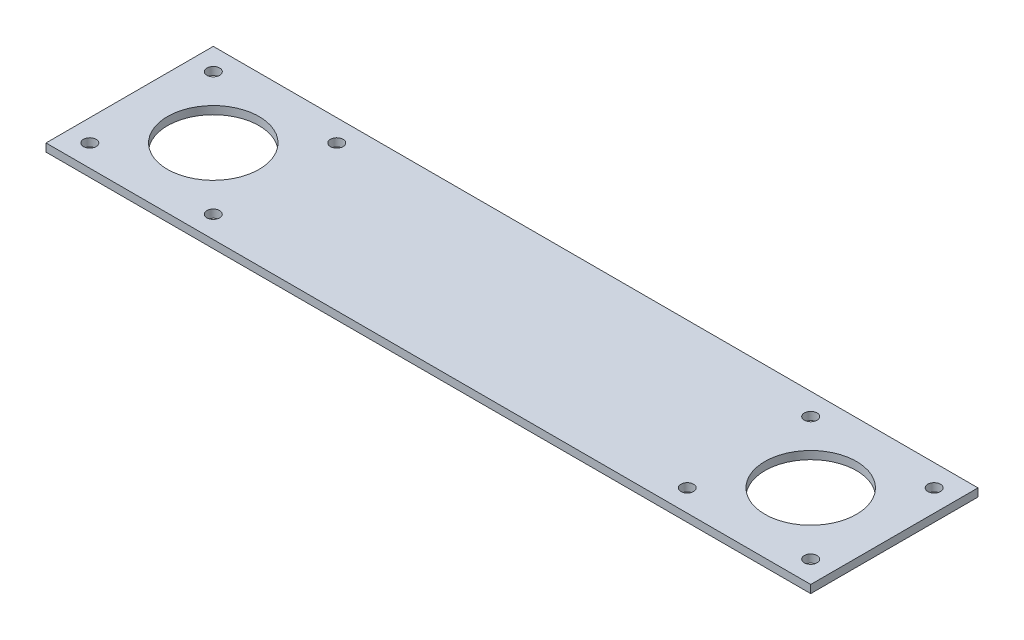
ISO-10303-21;
HEADER;
FILE_DESCRIPTION(('STEP AP214'),'2;1');
FILE_NAME('part.step','',(''),(''),'','','');
FILE_SCHEMA(('AUTOMOTIVE_DESIGN { 1 0 10303 214 1 1 1 1 }'));
ENDSEC;
DATA;
#1=APPLICATION_CONTEXT('core data for automotive mechanical design processes');
#2=APPLICATION_PROTOCOL_DEFINITION('international standard','automotive_design',2000,#1);
#3=PRODUCT_CONTEXT('',#1,'mechanical');
#4=PRODUCT('Part','Part','',(#3));
#5=PRODUCT_RELATED_PRODUCT_CATEGORY('part','',(#4));
#6=PRODUCT_DEFINITION_FORMATION('','',#4);
#7=PRODUCT_DEFINITION_CONTEXT('part definition',#1,'design');
#8=PRODUCT_DEFINITION('design','',#6,#7);
#9=PRODUCT_DEFINITION_SHAPE('','',#8);
#10=(LENGTH_UNIT() NAMED_UNIT(*) SI_UNIT(.MILLI.,.METRE.));
#11=(NAMED_UNIT(*) PLANE_ANGLE_UNIT() SI_UNIT($,.RADIAN.));
#12=(NAMED_UNIT(*) SI_UNIT($,.STERADIAN.) SOLID_ANGLE_UNIT());
#13=UNCERTAINTY_MEASURE_WITH_UNIT(LENGTH_MEASURE(1.E-05),#10,'distance_accuracy_value','');
#14=(GEOMETRIC_REPRESENTATION_CONTEXT(3) GLOBAL_UNCERTAINTY_ASSIGNED_CONTEXT((#13)) GLOBAL_UNIT_ASSIGNED_CONTEXT((#10,
#11,#12)) REPRESENTATION_CONTEXT('',''));
#15=CARTESIAN_POINT('',(0.,0.,0.));
#16=DIRECTION('',(0.,0.,1.));
#17=DIRECTION('',(1.,0.,0.));
#18=AXIS2_PLACEMENT_3D('',#15,#16,#17);
#19=CARTESIAN_POINT('',(96.,2.,0.));
#20=DIRECTION('',(1.,0.,0.));
#21=DIRECTION('',(0.,0.,-1.));
#22=AXIS2_PLACEMENT_3D('',#19,#20,#21);
#23=PLANE('',#22);
#24=DIRECTION('',(0.,0.,1.));
#25=VECTOR('',#24,1.);
#26=CARTESIAN_POINT('',(96.,0.,0.));
#27=LINE('',#26,#25);
#28=CARTESIAN_POINT('',(96.,0.,-21.));
#29=VERTEX_POINT('',#28);
#30=CARTESIAN_POINT('',(96.,0.,21.));
#31=VERTEX_POINT('',#30);
#32=EDGE_CURVE('E160',#29,#31,#27,.T.);
#33=ORIENTED_EDGE('',*,*,#32,.F.);
#34=DIRECTION('',(0.,-1.,0.));
#35=VECTOR('',#34,1.);
#36=CARTESIAN_POINT('',(96.,2.,-21.));
#37=LINE('',#36,#35);
#38=CARTESIAN_POINT('',(96.,2.,-21.));
#39=VERTEX_POINT('',#38);
#40=EDGE_CURVE('E11',#39,#29,#37,.T.);
#41=ORIENTED_EDGE('',*,*,#40,.F.);
#42=DIRECTION('',(0.,0.,1.));
#43=VECTOR('',#42,1.);
#44=CARTESIAN_POINT('',(96.,2.,0.));
#45=LINE('',#44,#43);
#46=CARTESIAN_POINT('',(96.,2.,21.));
#47=VERTEX_POINT('',#46);
#48=EDGE_CURVE('E110',#39,#47,#45,.T.);
#49=ORIENTED_EDGE('',*,*,#48,.T.);
#50=DIRECTION('',(0.,-1.,0.));
#51=VECTOR('',#50,1.);
#52=CARTESIAN_POINT('',(96.,2.,21.));
#53=LINE('',#52,#51);
#54=EDGE_CURVE('E86',#47,#31,#53,.T.);
#55=ORIENTED_EDGE('',*,*,#54,.T.);
#56=EDGE_LOOP('',(#33,#41,#49,#55));
#57=FACE_BOUND('',#56,.T.);
#58=ADVANCED_FACE('F45',(#57),#23,.T.);
#59=CARTESIAN_POINT('',(0.,2.,-21.));
#60=DIRECTION('',(0.,0.,-1.));
#61=DIRECTION('',(-1.,0.,0.));
#62=AXIS2_PLACEMENT_3D('',#59,#60,#61);
#63=PLANE('',#62);
#64=DIRECTION('',(1.,0.,0.));
#65=VECTOR('',#64,1.);
#66=CARTESIAN_POINT('',(0.,0.,-21.));
#67=LINE('',#66,#65);
#68=CARTESIAN_POINT('',(-96.,0.,-21.));
#69=VERTEX_POINT('',#68);
#70=EDGE_CURVE('E98',#69,#29,#67,.T.);
#71=ORIENTED_EDGE('',*,*,#70,.F.);
#72=DIRECTION('',(0.,-1.,0.));
#73=VECTOR('',#72,1.);
#74=CARTESIAN_POINT('',(-96.,2.,-21.));
#75=LINE('',#74,#73);
#76=CARTESIAN_POINT('',(-96.,2.,-21.));
#77=VERTEX_POINT('',#76);
#78=EDGE_CURVE('E55',#77,#69,#75,.T.);
#79=ORIENTED_EDGE('',*,*,#78,.F.);
#80=DIRECTION('',(1.,0.,0.));
#81=VECTOR('',#80,1.);
#82=CARTESIAN_POINT('',(0.,2.,-21.));
#83=LINE('',#82,#81);
#84=EDGE_CURVE('E96',#77,#39,#83,.T.);
#85=ORIENTED_EDGE('',*,*,#84,.T.);
#86=ORIENTED_EDGE('',*,*,#40,.T.);
#87=EDGE_LOOP('',(#71,#79,#85,#86));
#88=FACE_BOUND('',#87,.T.);
#89=ADVANCED_FACE('F94',(#88),#63,.T.);
#90=CARTESIAN_POINT('',(-96.,2.,0.));
#91=DIRECTION('',(1.,0.,0.));
#92=DIRECTION('',(0.,0.,-1.));
#93=AXIS2_PLACEMENT_3D('',#90,#91,#92);
#94=PLANE('',#93);
#95=DIRECTION('',(0.,0.,1.));
#96=VECTOR('',#95,1.);
#97=CARTESIAN_POINT('',(-96.,0.,0.));
#98=LINE('',#97,#96);
#99=CARTESIAN_POINT('',(-96.,0.,21.));
#100=VERTEX_POINT('',#99);
#101=EDGE_CURVE('E165',#69,#100,#98,.T.);
#102=ORIENTED_EDGE('',*,*,#101,.T.);
#103=DIRECTION('',(0.,-1.,0.));
#104=VECTOR('',#103,1.);
#105=CARTESIAN_POINT('',(-96.,2.,21.));
#106=LINE('',#105,#104);
#107=CARTESIAN_POINT('',(-96.,2.,21.));
#108=VERTEX_POINT('',#107);
#109=EDGE_CURVE('E102',#108,#100,#106,.T.);
#110=ORIENTED_EDGE('',*,*,#109,.F.);
#111=DIRECTION('',(0.,0.,1.));
#112=VECTOR('',#111,1.);
#113=CARTESIAN_POINT('',(-96.,2.,0.));
#114=LINE('',#113,#112);
#115=EDGE_CURVE('E104',#77,#108,#114,.T.);
#116=ORIENTED_EDGE('',*,*,#115,.F.);
#117=ORIENTED_EDGE('',*,*,#78,.T.);
#118=EDGE_LOOP('',(#102,#110,#116,#117));
#119=FACE_BOUND('',#118,.T.);
#120=ADVANCED_FACE('F105',(#119),#94,.F.);
#121=CARTESIAN_POINT('',(-75.,2.,0.));
#122=DIRECTION('',(0.,-1.,0.));
#123=DIRECTION('',(0.,0.,-1.));
#124=AXIS2_PLACEMENT_3D('',#121,#122,#123);
#125=CYLINDRICAL_SURFACE('',#124,11.5);
#126=CARTESIAN_POINT('',(-75.,2.,0.));
#127=DIRECTION('',(0.,1.,0.));
#128=DIRECTION('',(0.,0.,1.));
#129=AXIS2_PLACEMENT_3D('',#126,#127,#128);
#130=CIRCLE('',#129,11.5);
#131=CARTESIAN_POINT('',(-75.,2.,11.5));
#132=VERTEX_POINT('',#131);
#133=EDGE_CURVE('E144',#132,#132,#130,.T.);
#134=ORIENTED_EDGE('',*,*,#133,.T.);
#135=EDGE_LOOP('',(#134));
#136=FACE_BOUND('',#135,.T.);
#137=CARTESIAN_POINT('',(-75.,0.,0.));
#138=DIRECTION('',(0.,1.,0.));
#139=DIRECTION('',(0.,0.,1.));
#140=AXIS2_PLACEMENT_3D('',#137,#138,#139);
#141=CIRCLE('',#140,11.5);
#142=CARTESIAN_POINT('',(-75.,0.,11.5));
#143=VERTEX_POINT('',#142);
#144=EDGE_CURVE('E194',#143,#143,#141,.T.);
#145=ORIENTED_EDGE('',*,*,#144,.F.);
#146=EDGE_LOOP('',(#145));
#147=FACE_BOUND('',#146,.T.);
#148=ADVANCED_FACE('F246',(#136,#147),#125,.F.);
#149=CARTESIAN_POINT('',(59.5,2.,15.5));
#150=DIRECTION('',(0.,-1.,0.));
#151=DIRECTION('',(0.,0.,-1.));
#152=AXIS2_PLACEMENT_3D('',#149,#150,#151);
#153=CYLINDRICAL_SURFACE('',#152,1.6);
#154=CARTESIAN_POINT('',(59.5,2.,15.5));
#155=DIRECTION('',(0.,1.,0.));
#156=DIRECTION('',(0.,0.,1.));
#157=AXIS2_PLACEMENT_3D('',#154,#155,#156);
#158=CIRCLE('',#157,1.6);
#159=CARTESIAN_POINT('',(59.5,2.,17.1));
#160=VERTEX_POINT('',#159);
#161=EDGE_CURVE('E140',#160,#160,#158,.F.);
#162=ORIENTED_EDGE('',*,*,#161,.F.);
#163=EDGE_LOOP('',(#162));
#164=FACE_BOUND('',#163,.T.);
#165=CARTESIAN_POINT('',(59.5,0.,15.5));
#166=DIRECTION('',(0.,1.,0.));
#167=DIRECTION('',(0.,0.,1.));
#168=AXIS2_PLACEMENT_3D('',#165,#166,#167);
#169=CIRCLE('',#168,1.6);
#170=CARTESIAN_POINT('',(59.5,0.,17.1));
#171=VERTEX_POINT('',#170);
#172=EDGE_CURVE('E190',#171,#171,#169,.F.);
#173=ORIENTED_EDGE('',*,*,#172,.T.);
#174=EDGE_LOOP('',(#173));
#175=FACE_BOUND('',#174,.T.);
#176=ADVANCED_FACE('F249',(#164,#175),#153,.F.);
#177=CARTESIAN_POINT('',(90.5,2.,-15.5));
#178=DIRECTION('',(0.,-1.,0.));
#179=DIRECTION('',(0.,0.,-1.));
#180=AXIS2_PLACEMENT_3D('',#177,#178,#179);
#181=CYLINDRICAL_SURFACE('',#180,1.60000000000003);
#182=CARTESIAN_POINT('',(90.5,2.,-15.5));
#183=DIRECTION('',(0.,1.,0.));
#184=DIRECTION('',(0.,0.,1.));
#185=AXIS2_PLACEMENT_3D('',#182,#183,#184);
#186=CIRCLE('',#185,1.60000000000003);
#187=CARTESIAN_POINT('',(90.5,2.,-13.9));
#188=VERTEX_POINT('',#187);
#189=EDGE_CURVE('E136',#188,#188,#186,.F.);
#190=ORIENTED_EDGE('',*,*,#189,.F.);
#191=EDGE_LOOP('',(#190));
#192=FACE_BOUND('',#191,.T.);
#193=CARTESIAN_POINT('',(90.5,0.,-15.5));
#194=DIRECTION('',(0.,1.,0.));
#195=DIRECTION('',(0.,0.,1.));
#196=AXIS2_PLACEMENT_3D('',#193,#194,#195);
#197=CIRCLE('',#196,1.60000000000003);
#198=CARTESIAN_POINT('',(90.5,0.,-13.9));
#199=VERTEX_POINT('',#198);
#200=EDGE_CURVE('E186',#199,#199,#197,.F.);
#201=ORIENTED_EDGE('',*,*,#200,.T.);
#202=EDGE_LOOP('',(#201));
#203=FACE_BOUND('',#202,.T.);
#204=ADVANCED_FACE('F253',(#192,#203),#181,.F.);
#205=CARTESIAN_POINT('',(-90.5,2.,-15.5));
#206=DIRECTION('',(0.,-1.,0.));
#207=DIRECTION('',(0.,0.,-1.));
#208=AXIS2_PLACEMENT_3D('',#205,#206,#207);
#209=CYLINDRICAL_SURFACE('',#208,1.60000000000001);
#210=CARTESIAN_POINT('',(-90.5,2.,-15.5));
#211=DIRECTION('',(0.,1.,0.));
#212=DIRECTION('',(0.,0.,1.));
#213=AXIS2_PLACEMENT_3D('',#210,#211,#212);
#214=CIRCLE('',#213,1.60000000000001);
#215=CARTESIAN_POINT('',(-90.5,2.,-13.9));
#216=VERTEX_POINT('',#215);
#217=EDGE_CURVE('E132',#216,#216,#214,.T.);
#218=ORIENTED_EDGE('',*,*,#217,.T.);
#219=EDGE_LOOP('',(#218));
#220=FACE_BOUND('',#219,.T.);
#221=CARTESIAN_POINT('',(-90.5,0.,-15.5));
#222=DIRECTION('',(0.,1.,0.));
#223=DIRECTION('',(0.,0.,1.));
#224=AXIS2_PLACEMENT_3D('',#221,#222,#223);
#225=CIRCLE('',#224,1.60000000000001);
#226=CARTESIAN_POINT('',(-90.5,0.,-13.9));
#227=VERTEX_POINT('',#226);
#228=EDGE_CURVE('E182',#227,#227,#225,.T.);
#229=ORIENTED_EDGE('',*,*,#228,.F.);
#230=EDGE_LOOP('',(#229));
#231=FACE_BOUND('',#230,.T.);
#232=ADVANCED_FACE('F257',(#220,#231),#209,.F.);
#233=CARTESIAN_POINT('',(-90.5,2.,15.5));
#234=DIRECTION('',(0.,-1.,0.));
#235=DIRECTION('',(0.,0.,-1.));
#236=AXIS2_PLACEMENT_3D('',#233,#234,#235);
#237=CYLINDRICAL_SURFACE('',#236,1.6);
#238=CARTESIAN_POINT('',(-90.5,2.,15.5));
#239=DIRECTION('',(0.,1.,0.));
#240=DIRECTION('',(0.,0.,1.));
#241=AXIS2_PLACEMENT_3D('',#238,#239,#240);
#242=CIRCLE('',#241,1.6);
#243=CARTESIAN_POINT('',(-90.5,2.,17.1));
#244=VERTEX_POINT('',#243);
#245=EDGE_CURVE('E128',#244,#244,#242,.T.);
#246=ORIENTED_EDGE('',*,*,#245,.T.);
#247=EDGE_LOOP('',(#246));
#248=FACE_BOUND('',#247,.T.);
#249=CARTESIAN_POINT('',(-90.5,0.,15.5));
#250=DIRECTION('',(0.,1.,0.));
#251=DIRECTION('',(0.,0.,1.));
#252=AXIS2_PLACEMENT_3D('',#249,#250,#251);
#253=CIRCLE('',#252,1.6);
#254=CARTESIAN_POINT('',(-90.5,0.,17.1));
#255=VERTEX_POINT('',#254);
#256=EDGE_CURVE('E178',#255,#255,#253,.T.);
#257=ORIENTED_EDGE('',*,*,#256,.F.);
#258=EDGE_LOOP('',(#257));
#259=FACE_BOUND('',#258,.T.);
#260=ADVANCED_FACE('F261',(#248,#259),#237,.F.);
#261=CARTESIAN_POINT('',(-59.5,2.,15.5));
#262=DIRECTION('',(0.,-1.,0.));
#263=DIRECTION('',(0.,0.,-1.));
#264=AXIS2_PLACEMENT_3D('',#261,#262,#263);
#265=CYLINDRICAL_SURFACE('',#264,1.6);
#266=CARTESIAN_POINT('',(-59.5,2.,15.5));
#267=DIRECTION('',(0.,1.,0.));
#268=DIRECTION('',(0.,0.,1.));
#269=AXIS2_PLACEMENT_3D('',#266,#267,#268);
#270=CIRCLE('',#269,1.6);
#271=CARTESIAN_POINT('',(-59.5,2.,17.1));
#272=VERTEX_POINT('',#271);
#273=EDGE_CURVE('E124',#272,#272,#270,.T.);
#274=ORIENTED_EDGE('',*,*,#273,.T.);
#275=EDGE_LOOP('',(#274));
#276=FACE_BOUND('',#275,.T.);
#277=CARTESIAN_POINT('',(-59.5,0.,15.5));
#278=DIRECTION('',(0.,1.,0.));
#279=DIRECTION('',(0.,0.,1.));
#280=AXIS2_PLACEMENT_3D('',#277,#278,#279);
#281=CIRCLE('',#280,1.6);
#282=CARTESIAN_POINT('',(-59.5,0.,17.1));
#283=VERTEX_POINT('',#282);
#284=EDGE_CURVE('E174',#283,#283,#281,.T.);
#285=ORIENTED_EDGE('',*,*,#284,.F.);
#286=EDGE_LOOP('',(#285));
#287=FACE_BOUND('',#286,.T.);
#288=ADVANCED_FACE('F265',(#276,#287),#265,.F.);
#289=CARTESIAN_POINT('',(-59.5,2.,-15.5));
#290=DIRECTION('',(0.,-1.,0.));
#291=DIRECTION('',(0.,0.,-1.));
#292=AXIS2_PLACEMENT_3D('',#289,#290,#291);
#293=CYLINDRICAL_SURFACE('',#292,1.60000000000001);
#294=CARTESIAN_POINT('',(-59.5,2.,-15.5));
#295=DIRECTION('',(0.,1.,0.));
#296=DIRECTION('',(0.,0.,1.));
#297=AXIS2_PLACEMENT_3D('',#294,#295,#296);
#298=CIRCLE('',#297,1.60000000000001);
#299=CARTESIAN_POINT('',(-59.5,2.,-13.9));
#300=VERTEX_POINT('',#299);
#301=EDGE_CURVE('E120',#300,#300,#298,.T.);
#302=ORIENTED_EDGE('',*,*,#301,.T.);
#303=EDGE_LOOP('',(#302));
#304=FACE_BOUND('',#303,.T.);
#305=CARTESIAN_POINT('',(-59.5,0.,-15.5));
#306=DIRECTION('',(0.,1.,0.));
#307=DIRECTION('',(0.,0.,1.));
#308=AXIS2_PLACEMENT_3D('',#305,#306,#307);
#309=CIRCLE('',#308,1.60000000000001);
#310=CARTESIAN_POINT('',(-59.5,0.,-13.9));
#311=VERTEX_POINT('',#310);
#312=EDGE_CURVE('E170',#311,#311,#309,.T.);
#313=ORIENTED_EDGE('',*,*,#312,.F.);
#314=EDGE_LOOP('',(#313));
#315=FACE_BOUND('',#314,.T.);
#316=ADVANCED_FACE('F226',(#304,#315),#293,.F.);
#317=CARTESIAN_POINT('',(0.,2.,21.));
#318=DIRECTION('',(0.,0.,-1.));
#319=DIRECTION('',(-1.,0.,0.));
#320=AXIS2_PLACEMENT_3D('',#317,#318,#319);
#321=PLANE('',#320);
#322=DIRECTION('',(1.,0.,0.));
#323=VECTOR('',#322,1.);
#324=CARTESIAN_POINT('',(0.,0.,21.));
#325=LINE('',#324,#323);
#326=EDGE_CURVE('E79',#100,#31,#325,.T.);
#327=ORIENTED_EDGE('',*,*,#326,.T.);
#328=ORIENTED_EDGE('',*,*,#54,.F.);
#329=DIRECTION('',(1.,0.,0.));
#330=VECTOR('',#329,1.);
#331=CARTESIAN_POINT('',(0.,2.,21.));
#332=LINE('',#331,#330);
#333=EDGE_CURVE('E63',#108,#47,#332,.T.);
#334=ORIENTED_EDGE('',*,*,#333,.F.);
#335=ORIENTED_EDGE('',*,*,#109,.T.);
#336=EDGE_LOOP('',(#327,#328,#334,#335));
#337=FACE_BOUND('',#336,.T.);
#338=ADVANCED_FACE('F207',(#337),#321,.F.);
#339=CARTESIAN_POINT('',(90.5,2.,15.5));
#340=DIRECTION('',(0.,-1.,0.));
#341=DIRECTION('',(0.,0.,-1.));
#342=AXIS2_PLACEMENT_3D('',#339,#340,#341);
#343=CYLINDRICAL_SURFACE('',#342,1.6);
#344=CARTESIAN_POINT('',(90.5,2.,15.5));
#345=DIRECTION('',(0.,1.,0.));
#346=DIRECTION('',(0.,0.,1.));
#347=AXIS2_PLACEMENT_3D('',#344,#345,#346);
#348=CIRCLE('',#347,1.6);
#349=CARTESIAN_POINT('',(90.5,2.,17.1));
#350=VERTEX_POINT('',#349);
#351=EDGE_CURVE('E114',#350,#350,#348,.F.);
#352=ORIENTED_EDGE('',*,*,#351,.F.);
#353=EDGE_LOOP('',(#352));
#354=FACE_BOUND('',#353,.T.);
#355=CARTESIAN_POINT('',(90.5,0.,15.5));
#356=DIRECTION('',(0.,1.,0.));
#357=DIRECTION('',(0.,0.,1.));
#358=AXIS2_PLACEMENT_3D('',#355,#356,#357);
#359=CIRCLE('',#358,1.6);
#360=CARTESIAN_POINT('',(90.5,0.,17.1));
#361=VERTEX_POINT('',#360);
#362=EDGE_CURVE('E156',#361,#361,#359,.F.);
#363=ORIENTED_EDGE('',*,*,#362,.T.);
#364=EDGE_LOOP('',(#363));
#365=FACE_BOUND('',#364,.T.);
#366=ADVANCED_FACE('F217',(#354,#365),#343,.F.);
#367=CARTESIAN_POINT('',(59.5,2.,-15.5));
#368=DIRECTION('',(0.,-1.,0.));
#369=DIRECTION('',(0.,0.,-1.));
#370=AXIS2_PLACEMENT_3D('',#367,#368,#369);
#371=CYLINDRICAL_SURFACE('',#370,1.60000000000002);
#372=CARTESIAN_POINT('',(59.5,2.,-15.5));
#373=DIRECTION('',(0.,1.,0.));
#374=DIRECTION('',(0.,0.,1.));
#375=AXIS2_PLACEMENT_3D('',#372,#373,#374);
#376=CIRCLE('',#375,1.60000000000002);
#377=CARTESIAN_POINT('',(59.5,2.,-13.9));
#378=VERTEX_POINT('',#377);
#379=EDGE_CURVE('E202',#378,#378,#376,.F.);
#380=ORIENTED_EDGE('',*,*,#379,.F.);
#381=EDGE_LOOP('',(#380));
#382=FACE_BOUND('',#381,.T.);
#383=CARTESIAN_POINT('',(59.5,0.,-15.5));
#384=DIRECTION('',(0.,1.,0.));
#385=DIRECTION('',(0.,0.,1.));
#386=AXIS2_PLACEMENT_3D('',#383,#384,#385);
#387=CIRCLE('',#386,1.60000000000002);
#388=CARTESIAN_POINT('',(59.5,0.,-13.9));
#389=VERTEX_POINT('',#388);
#390=EDGE_CURVE('E152',#389,#389,#387,.F.);
#391=ORIENTED_EDGE('',*,*,#390,.T.);
#392=EDGE_LOOP('',(#391));
#393=FACE_BOUND('',#392,.T.);
#394=ADVANCED_FACE('F47',(#382,#393),#371,.F.);
#395=CARTESIAN_POINT('',(75.,2.,0.));
#396=DIRECTION('',(0.,-1.,0.));
#397=DIRECTION('',(0.,0.,-1.));
#398=AXIS2_PLACEMENT_3D('',#395,#396,#397);
#399=CYLINDRICAL_SURFACE('',#398,11.5);
#400=CARTESIAN_POINT('',(75.,2.,0.));
#401=DIRECTION('',(0.,1.,0.));
#402=DIRECTION('',(0.,0.,1.));
#403=AXIS2_PLACEMENT_3D('',#400,#401,#402);
#404=CIRCLE('',#403,11.5);
#405=CARTESIAN_POINT('',(75.,2.,11.5));
#406=VERTEX_POINT('',#405);
#407=EDGE_CURVE('E148',#406,#406,#404,.F.);
#408=ORIENTED_EDGE('',*,*,#407,.F.);
#409=EDGE_LOOP('',(#408));
#410=FACE_BOUND('',#409,.T.);
#411=CARTESIAN_POINT('',(75.,0.,0.));
#412=DIRECTION('',(0.,1.,0.));
#413=DIRECTION('',(0.,0.,1.));
#414=AXIS2_PLACEMENT_3D('',#411,#412,#413);
#415=CIRCLE('',#414,11.5);
#416=CARTESIAN_POINT('',(75.,0.,11.5));
#417=VERTEX_POINT('',#416);
#418=EDGE_CURVE('E198',#417,#417,#415,.F.);
#419=ORIENTED_EDGE('',*,*,#418,.T.);
#420=EDGE_LOOP('',(#419));
#421=FACE_BOUND('',#420,.T.);
#422=ADVANCED_FACE('F224',(#410,#421),#399,.F.);
#423=CARTESIAN_POINT('',(0.,2.,0.));
#424=DIRECTION('',(0.,1.,0.));
#425=DIRECTION('',(0.,0.,1.));
#426=AXIS2_PLACEMENT_3D('',#423,#424,#425);
#427=PLANE('',#426);
#428=ORIENTED_EDGE('',*,*,#379,.T.);
#429=EDGE_LOOP('',(#428));
#430=FACE_BOUND('',#429,.T.);
#431=ORIENTED_EDGE('',*,*,#351,.T.);
#432=EDGE_LOOP('',(#431));
#433=FACE_BOUND('',#432,.T.);
#434=ORIENTED_EDGE('',*,*,#48,.F.);
#435=ORIENTED_EDGE('',*,*,#84,.F.);
#436=ORIENTED_EDGE('',*,*,#115,.T.);
#437=ORIENTED_EDGE('',*,*,#333,.T.);
#438=EDGE_LOOP('',(#434,#435,#436,#437));
#439=FACE_BOUND('',#438,.T.);
#440=ORIENTED_EDGE('',*,*,#301,.F.);
#441=EDGE_LOOP('',(#440));
#442=FACE_BOUND('',#441,.T.);
#443=ORIENTED_EDGE('',*,*,#273,.F.);
#444=EDGE_LOOP('',(#443));
#445=FACE_BOUND('',#444,.T.);
#446=ORIENTED_EDGE('',*,*,#245,.F.);
#447=EDGE_LOOP('',(#446));
#448=FACE_BOUND('',#447,.T.);
#449=ORIENTED_EDGE('',*,*,#217,.F.);
#450=EDGE_LOOP('',(#449));
#451=FACE_BOUND('',#450,.T.);
#452=ORIENTED_EDGE('',*,*,#189,.T.);
#453=EDGE_LOOP('',(#452));
#454=FACE_BOUND('',#453,.T.);
#455=ORIENTED_EDGE('',*,*,#161,.T.);
#456=EDGE_LOOP('',(#455));
#457=FACE_BOUND('',#456,.T.);
#458=ORIENTED_EDGE('',*,*,#133,.F.);
#459=EDGE_LOOP('',(#458));
#460=FACE_BOUND('',#459,.T.);
#461=ORIENTED_EDGE('',*,*,#407,.T.);
#462=EDGE_LOOP('',(#461));
#463=FACE_BOUND('',#462,.T.);
#464=ADVANCED_FACE('F108',(#430,#433,#439,#442,#445,#448,#451,#454,#457,#460,#463),#427,.T.);
#465=CARTESIAN_POINT('',(0.,0.,0.));
#466=DIRECTION('',(0.,1.,0.));
#467=DIRECTION('',(0.,0.,1.));
#468=AXIS2_PLACEMENT_3D('',#465,#466,#467);
#469=PLANE('',#468);
#470=ORIENTED_EDGE('',*,*,#390,.F.);
#471=EDGE_LOOP('',(#470));
#472=FACE_BOUND('',#471,.T.);
#473=ORIENTED_EDGE('',*,*,#362,.F.);
#474=EDGE_LOOP('',(#473));
#475=FACE_BOUND('',#474,.T.);
#476=ORIENTED_EDGE('',*,*,#32,.T.);
#477=ORIENTED_EDGE('',*,*,#326,.F.);
#478=ORIENTED_EDGE('',*,*,#101,.F.);
#479=ORIENTED_EDGE('',*,*,#70,.T.);
#480=EDGE_LOOP('',(#476,#477,#478,#479));
#481=FACE_BOUND('',#480,.T.);
#482=ORIENTED_EDGE('',*,*,#312,.T.);
#483=EDGE_LOOP('',(#482));
#484=FACE_BOUND('',#483,.T.);
#485=ORIENTED_EDGE('',*,*,#284,.T.);
#486=EDGE_LOOP('',(#485));
#487=FACE_BOUND('',#486,.T.);
#488=ORIENTED_EDGE('',*,*,#256,.T.);
#489=EDGE_LOOP('',(#488));
#490=FACE_BOUND('',#489,.T.);
#491=ORIENTED_EDGE('',*,*,#228,.T.);
#492=EDGE_LOOP('',(#491));
#493=FACE_BOUND('',#492,.T.);
#494=ORIENTED_EDGE('',*,*,#200,.F.);
#495=EDGE_LOOP('',(#494));
#496=FACE_BOUND('',#495,.T.);
#497=ORIENTED_EDGE('',*,*,#172,.F.);
#498=EDGE_LOOP('',(#497));
#499=FACE_BOUND('',#498,.T.);
#500=ORIENTED_EDGE('',*,*,#144,.T.);
#501=EDGE_LOOP('',(#500));
#502=FACE_BOUND('',#501,.T.);
#503=ORIENTED_EDGE('',*,*,#418,.F.);
#504=EDGE_LOOP('',(#503));
#505=FACE_BOUND('',#504,.T.);
#506=ADVANCED_FACE('F208',(#472,#475,#481,#484,#487,#490,#493,#496,#499,#502,#505),#469,.F.);
#507=CLOSED_SHELL('',(#58,#89,#120,#148,#176,#204,#232,#260,#288,#316,#338,#366,#394,#422,#464,#506));
#508=MANIFOLD_SOLID_BREP('B2',#507);
#509=ADVANCED_BREP_SHAPE_REPRESENTATION('',(#18,#508),#14);
#510=SHAPE_DEFINITION_REPRESENTATION(#9,#509);
ENDSEC;
END-ISO-10303-21;
